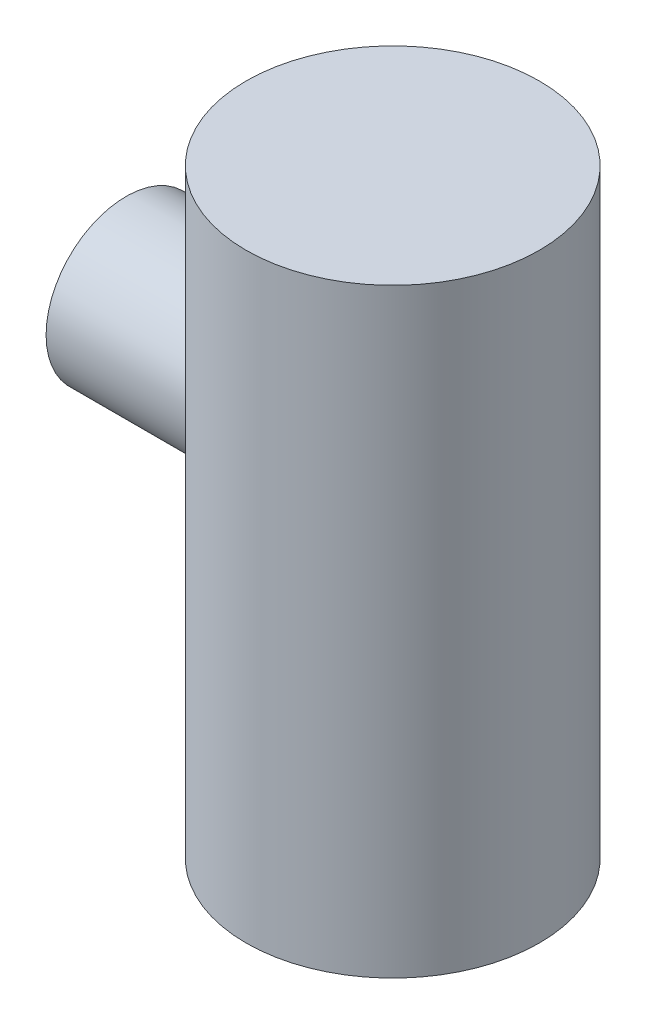
ISO-10303-21;
HEADER;
FILE_DESCRIPTION(('STEP AP214'),'2;1');
FILE_NAME('part.step','',(''),(''),'','','');
FILE_SCHEMA(('AUTOMOTIVE_DESIGN { 1 0 10303 214 1 1 1 1 }'));
ENDSEC;
DATA;
#1=APPLICATION_CONTEXT('core data for automotive mechanical design processes');
#2=APPLICATION_PROTOCOL_DEFINITION('international standard','automotive_design',2000,#1);
#3=PRODUCT_CONTEXT('',#1,'mechanical');
#4=PRODUCT('Part','Part','',(#3));
#5=PRODUCT_RELATED_PRODUCT_CATEGORY('part','',(#4));
#6=PRODUCT_DEFINITION_FORMATION('','',#4);
#7=PRODUCT_DEFINITION_CONTEXT('part definition',#1,'design');
#8=PRODUCT_DEFINITION('design','',#6,#7);
#9=PRODUCT_DEFINITION_SHAPE('','',#8);
#10=(LENGTH_UNIT() NAMED_UNIT(*) SI_UNIT(.MILLI.,.METRE.));
#11=(NAMED_UNIT(*) PLANE_ANGLE_UNIT() SI_UNIT($,.RADIAN.));
#12=(NAMED_UNIT(*) SI_UNIT($,.STERADIAN.) SOLID_ANGLE_UNIT());
#13=UNCERTAINTY_MEASURE_WITH_UNIT(LENGTH_MEASURE(1.E-05),#10,'distance_accuracy_value','');
#14=(GEOMETRIC_REPRESENTATION_CONTEXT(3) GLOBAL_UNCERTAINTY_ASSIGNED_CONTEXT((#13)) GLOBAL_UNIT_ASSIGNED_CONTEXT((#10,
#11,#12)) REPRESENTATION_CONTEXT('',''));
#15=CARTESIAN_POINT('',(0.,0.,0.));
#16=DIRECTION('',(0.,0.,1.));
#17=DIRECTION('',(1.,0.,0.));
#18=AXIS2_PLACEMENT_3D('',#15,#16,#17);
#19=CARTESIAN_POINT('',(0.,114.3,0.));
#20=DIRECTION('',(0.,-1.,0.));
#21=DIRECTION('',(0.,0.,-1.));
#22=AXIS2_PLACEMENT_3D('',#19,#20,#21);
#23=CYLINDRICAL_SURFACE('',#22,27.94);
#24=CARTESIAN_POINT('',(-27.94,28.575,0.));
#25=CARTESIAN_POINT('',(-27.9399977109418,28.5749923753979,0.177726493025734));
#26=CARTESIAN_POINT('',(-27.9382862587098,28.5600268653449,0.355567155420309));
#27=CARTESIAN_POINT('',(-27.9316235327957,28.5005577744009,0.706308578503385));
#28=CARTESIAN_POINT('',(-27.9266687863786,28.4560225311868,0.879203836592862));
#29=CARTESIAN_POINT('',(-27.9140781927207,28.3387354462199,1.21492529506599));
#30=CARTESIAN_POINT('',(-27.9064440614806,28.2660016609927,1.37775786174449));
#31=CARTESIAN_POINT('',(-27.8893459603641,28.0944195615946,1.68887152995537));
#32=CARTESIAN_POINT('',(-27.8798823284444,27.995576069335,1.83715531141358));
#33=CARTESIAN_POINT('',(-27.8601349618844,27.7740946885637,2.1156757081925));
#34=CARTESIAN_POINT('',(-27.8498480315765,27.6513611419821,2.24583603642154));
#35=CARTESIAN_POINT('',(-27.8296395480978,27.3857885013388,2.48375833310637));
#36=CARTESIAN_POINT('',(-27.8197180127136,27.2429484301635,2.59151921238911));
#37=CARTESIAN_POINT('',(-27.8013317623023,26.9407297526066,2.78186167739817));
#38=CARTESIAN_POINT('',(-27.7928711477832,26.7813065451914,2.86437287739365));
#39=CARTESIAN_POINT('',(-27.7784058118464,26.4507549024244,3.00142435019446));
#40=CARTESIAN_POINT('',(-27.7724010130427,26.2796268361067,3.05596550438725));
#41=CARTESIAN_POINT('',(-27.7635570650764,25.9313091553327,3.13529932844987));
#42=CARTESIAN_POINT('',(-27.7607043151531,25.7541490105764,3.16021984384838));
#43=CARTESIAN_POINT('',(-27.7584456007982,25.3981396840878,3.18000039489289));
#44=CARTESIAN_POINT('',(-27.7590395209577,25.2192905591098,3.17486143705606));
#45=CARTESIAN_POINT('',(-27.7635946021711,24.8658664250491,3.13477406315418));
#46=CARTESIAN_POINT('',(-27.7675399230913,24.691275277644,3.09996587375451));
#47=CARTESIAN_POINT('',(-27.7783285530449,24.3504287516643,3.00174661369565));
#48=CARTESIAN_POINT('',(-27.785171911423,24.1841735150789,2.93833505600678));
#49=CARTESIAN_POINT('',(-27.8010036468343,23.8642790166213,2.78455640720902));
#50=CARTESIAN_POINT('',(-27.8099969123514,23.7106695949077,2.69412776556504));
#51=CARTESIAN_POINT('',(-27.8291112185739,23.420753898942,2.48892600790803));
#52=CARTESIAN_POINT('',(-27.839232301925,23.2844482794079,2.37415197118544));
#53=CARTESIAN_POINT('',(-27.8595323727865,23.0321950302007,2.12273737537937));
#54=CARTESIAN_POINT('',(-27.8697113613144,22.9163679466687,1.98597583385981));
#55=CARTESIAN_POINT('',(-27.8889260991379,22.7092962087504,1.69488664217585));
#56=CARTESIAN_POINT('',(-27.8979618465154,22.6180515956063,1.54055896254118));
#57=CARTESIAN_POINT('',(-27.9138762968433,22.4627371864451,1.21862987580965));
#58=CARTESIAN_POINT('',(-27.9207544553354,22.3986742481702,1.05102513164616));
#59=CARTESIAN_POINT('',(-27.9315735545041,22.2996338460639,0.707342260946025));
#60=CARTESIAN_POINT('',(-27.9355146087106,22.2646552580083,0.531264462204478));
#61=CARTESIAN_POINT('',(-27.9400007826411,22.224931111337,0.176676764342702));
#62=CARTESIAN_POINT('',(-27.9405645699206,22.2200193575464,-0.00181428946255621));
#63=CARTESIAN_POINT('',(-27.9382829222867,22.240130718575,-0.357076979208575));
#64=CARTESIAN_POINT('',(-27.9354375471324,22.2651533086766,-0.53384864523364));
#65=CARTESIAN_POINT('',(-27.9266690458364,22.3442850763063,-0.880169427327214));
#66=CARTESIAN_POINT('',(-27.9207542335601,22.3983156963966,-1.04973672155552));
#67=CARTESIAN_POINT('',(-27.906509680628,22.5338485751161,-1.3774023069347));
#68=CARTESIAN_POINT('',(-27.898179871158,22.6153516165685,-1.53550027111238));
#69=CARTESIAN_POINT('',(-27.8799888771011,22.8039227079589,-1.83648605535923));
#70=CARTESIAN_POINT('',(-27.8701212676476,22.9110990777626,-1.97930561700081));
#71=CARTESIAN_POINT('',(-27.8499805446274,23.1478202488672,-2.24498770244583));
#72=CARTESIAN_POINT('',(-27.8397074178496,23.2773657793807,-2.36784957539485));
#73=CARTESIAN_POINT('',(-27.8198565831892,23.5558767478562,-2.59071229549484));
#74=CARTESIAN_POINT('',(-27.8102823537933,23.7049302087914,-2.69060349482674));
#75=CARTESIAN_POINT('',(-27.7929686060496,24.017795466638,-2.86393363542961));
#76=CARTESIAN_POINT('',(-27.785229056429,24.181607011926,-2.93737302759346));
#77=CARTESIAN_POINT('',(-27.7724838198148,24.5189739504899,-3.0555344360088));
#78=CARTESIAN_POINT('',(-27.7674720948894,24.6925068783265,-3.10031991547082));
#79=CARTESIAN_POINT('',(-27.7607320041799,25.0446900326591,-3.16010735382826));
#80=CARTESIAN_POINT('',(-27.759003514106,25.2233400651824,-3.17511044016476));
#81=CARTESIAN_POINT('',(-27.7590287603174,25.5795959269791,-3.17488896167793));
#82=CARTESIAN_POINT('',(-27.7607626543748,25.7572018895908,-3.15983663840781));
#83=CARTESIAN_POINT('',(-27.7674748158608,26.1073433183981,-3.10029463019608));
#84=CARTESIAN_POINT('',(-27.772453085373,26.2798787813372,-3.05580492634959));
#85=CARTESIAN_POINT('',(-27.7850872442106,26.6149690560936,-2.93870193735184));
#86=CARTESIAN_POINT('',(-27.7927424895534,26.7775262572701,-2.86609541562951));
#87=CARTESIAN_POINT('',(-27.809869235819,27.0881760497359,-2.6948370030244));
#88=CARTESIAN_POINT('',(-27.8193407437607,27.2362685851237,-2.59618501148953));
#89=CARTESIAN_POINT('',(-27.839097900828,27.5146671676606,-2.37499267977462));
#90=CARTESIAN_POINT('',(-27.8493877436328,27.6448708432514,-2.25232386030035));
#91=CARTESIAN_POINT('',(-27.8695844409381,27.8829152477503,-1.98684335479591));
#92=CARTESIAN_POINT('',(-27.8794912039081,27.9907506586777,-1.84402689225884));
#93=CARTESIAN_POINT('',(-27.8978394068627,28.1812797148728,-1.54179502521832));
#94=CARTESIAN_POINT('',(-27.9062761001334,28.2638925418281,-1.38232841577389));
#95=CARTESIAN_POINT('',(-27.9206841464976,28.4010533434178,-1.05178536089044));
#96=CARTESIAN_POINT('',(-27.9266582257361,28.4556323683905,-0.880721998908063));
#97=CARTESIAN_POINT('',(-27.9339982756156,28.5218478620223,-0.5906101971984));
#98=CARTESIAN_POINT('',(-27.9362381854083,28.5417519550023,-0.473403942302186));
#99=CARTESIAN_POINT('',(-27.9392398082135,28.5683305337763,-0.237482113836395));
#100=CARTESIAN_POINT('',(-27.9400015296737,28.5750050951755,-0.118766548896249));
#101=CARTESIAN_POINT('',(-27.94,28.575,0.));
#102=B_SPLINE_CURVE_WITH_KNOTS('',3,(#24,#25,#26,#27,#28,#29,#30,#31,#32,#33,#34,#35,#36,#37,
#38,#39,#40,#41,#42,#43,#44,#45,#46,#47,#48,#49,#50,#51,#52,#53,#54,#55,#56,#57,#58,#59,#60,#61,
#62,#63,#64,#65,#66,#67,#68,#69,#70,#71,#72,#73,#74,#75,#76,#77,#78,#79,#80,#81,#82,#83,#84,#85,
#86,#87,#88,#89,#90,#91,#92,#93,#94,#95,#96,#97,#98,#99,#100,#101),.UNSPECIFIED.,.T.,.F.,(4,2,2,
2,2,2,2,2,2,2,2,2,2,2,2,2,2,2,2,2,2,2,2,2,2,2,2,2,2,2,2,2,2,2,2,2,2,2,4),(0.,0.5327457241294,
1.06606281725818,1.59903897109533,2.13191676422734,2.66697385257084,3.20205695197831,
3.73861833398452,4.27516280691826,4.80938299437484,5.34358529400241,5.87527668730579,
6.40697713406298,6.93989826358357,7.47283955104731,8.00882047731427,8.54480230279611,
9.08091927237255,9.61701551796464,10.1501457826337,10.6832667022264,11.2149510918224,
11.746650632982,12.2806342864763,12.8146353505977,13.3511348113049,13.8876251265029,
14.4229230617994,14.9582007324924,15.4904196377583,16.0226388848193,16.5547301873412,
17.0868235461472,17.621845229172,18.1569939664043,18.69383985636,19.2300898446913,
19.5861016672066,19.9421114551503),.UNSPECIFIED.);
#103=CARTESIAN_POINT('',(-27.94,28.575,0.));
#104=VERTEX_POINT('',#103);
#105=EDGE_CURVE('E91',#104,#104,#102,.T.);
#106=ORIENTED_EDGE('',*,*,#105,.T.);
#107=EDGE_LOOP('',(#106));
#108=FACE_BOUND('',#107,.T.);
#109=CARTESIAN_POINT('',(0.,114.3,0.));
#110=DIRECTION('',(0.,1.,0.));
#111=DIRECTION('',(0.,0.,1.));
#112=AXIS2_PLACEMENT_3D('',#109,#110,#111);
#113=CIRCLE('',#112,27.94);
#114=CARTESIAN_POINT('',(0.,114.3,27.94));
#115=VERTEX_POINT('',#114);
#116=EDGE_CURVE('E53',#115,#115,#113,.T.);
#117=ORIENTED_EDGE('',*,*,#116,.F.);
#118=EDGE_LOOP('',(#117));
#119=FACE_BOUND('',#118,.T.);
#120=CARTESIAN_POINT('',(0.,0.,0.));
#121=DIRECTION('',(0.,1.,0.));
#122=DIRECTION('',(0.,0.,1.));
#123=AXIS2_PLACEMENT_3D('',#120,#121,#122);
#124=CIRCLE('',#123,27.94);
#125=CARTESIAN_POINT('',(0.,0.,27.94));
#126=VERTEX_POINT('',#125);
#127=EDGE_CURVE('E95',#126,#126,#124,.T.);
#128=ORIENTED_EDGE('',*,*,#127,.T.);
#129=EDGE_LOOP('',(#128));
#130=FACE_BOUND('',#129,.T.);
#131=CARTESIAN_POINT('',(-23.4176429215239,68.58,15.24));
#132=CARTESIAN_POINT('',(-23.4176383820855,68.9713251294594,15.2400034501273));
#133=CARTESIAN_POINT('',(-23.4274835983225,69.3626120252211,15.2249099053513));
#134=CARTESIAN_POINT('',(-23.4664545607048,70.1420491278527,15.1647752538329));
#135=CARTESIAN_POINT('',(-23.4955868779533,70.5301982200386,15.1197239404747));
#136=CARTESIAN_POINT('',(-23.572037025561,71.3006925345169,15.0002558070464));
#137=CARTESIAN_POINT('',(-23.6193816728181,71.6830283298821,14.925795679378));
#138=CARTESIAN_POINT('',(-23.7304656038211,72.4385833449601,14.7485427780727));
#139=CARTESIAN_POINT('',(-23.7942039577523,72.8118030804013,14.6457516112858));
#140=CARTESIAN_POINT('',(-23.935415497499,73.5445319497101,14.4138049542253));
#141=CARTESIAN_POINT('',(-24.0127981965139,73.9041135278635,14.2848223548774));
#142=CARTESIAN_POINT('',(-24.1792052311072,74.6104095532767,14.001308621911));
#143=CARTESIAN_POINT('',(-24.2682341206373,74.9571188987307,13.8467674879863));
#144=CARTESIAN_POINT('',(-24.4554154484938,75.6360500249483,13.5134293802223));
#145=CARTESIAN_POINT('',(-24.5535672236517,75.9682728562025,13.3346341690473));
#146=CARTESIAN_POINT('',(-24.7565130907444,76.6170316985802,12.9539637279667));
#147=CARTESIAN_POINT('',(-24.8613067270604,76.933568783067,12.7520900804351));
#148=CARTESIAN_POINT('',(-25.0857644468004,77.5805876882586,12.3051451612256));
#149=CARTESIAN_POINT('',(-25.2058714267114,77.9093295362219,12.0577747191158));
#150=CARTESIAN_POINT('',(-25.448129647856,78.5453283996593,11.5377031344762));
#151=CARTESIAN_POINT('',(-25.5702810020631,78.8525842229114,11.2650005882639));
#152=CARTESIAN_POINT('',(-25.813767994526,79.4445038292519,10.6952796638071));
#153=CARTESIAN_POINT('',(-25.9351029545473,79.7291505477039,10.3982432562462));
#154=CARTESIAN_POINT('',(-26.1739847179127,80.2740764148968,9.78138463809));
#155=CARTESIAN_POINT('',(-26.2915328513444,80.5343641820596,9.46157055751187));
#156=CARTESIAN_POINT('',(-26.529828872945,81.0500621227847,8.77243641904143));
#157=CARTESIAN_POINT('',(-26.6500088182614,81.303204555108,8.40121638677076));
#158=CARTESIAN_POINT('',(-26.8794501040104,81.7770379690629,7.63534894022219));
#159=CARTESIAN_POINT('',(-26.9887106667686,81.9977266398766,7.24069986052223));
#160=CARTESIAN_POINT('',(-27.193111046209,82.4042594138218,6.43060571123405));
#161=CARTESIAN_POINT('',(-27.2882589331282,82.590123447316,6.01517270997962));
#162=CARTESIAN_POINT('',(-27.4616257624459,82.9248738930584,5.16626395294078));
#163=CARTESIAN_POINT('',(-27.5398469128985,83.0737651286976,4.73279055929085));
#164=CARTESIAN_POINT('',(-27.6712555520536,83.3218624497381,3.8875282384062));
#165=CARTESIAN_POINT('',(-27.7259704177376,83.4241427646741,3.47687819215716));
#166=CARTESIAN_POINT('',(-27.8175074717554,83.5944227745293,2.64655744037078));
#167=CARTESIAN_POINT('',(-27.8543305561587,83.6624241862363,2.2268871876896));
#168=CARTESIAN_POINT('',(-27.9089879103373,83.7631286133492,1.38236672983906));
#169=CARTESIAN_POINT('',(-27.9268340093024,83.7958536182662,0.957519918715855));
#170=CARTESIAN_POINT('',(-27.9430403198644,83.8255786782469,0.106219923132054));
#171=CARTESIAN_POINT('',(-27.9414020393116,83.8225814977666,-0.320233134471584));
#172=CARTESIAN_POINT('',(-27.9198727636314,83.7830755597573,-1.12693068810305));
#173=CARTESIAN_POINT('',(-27.9018824488156,83.7500562953649,-1.50740308739781));
#174=CARTESIAN_POINT('',(-27.8507201449013,83.6557483058025,-2.26376437529911));
#175=CARTESIAN_POINT('',(-27.8175494360373,83.5944619645255,-2.63965364767852));
#176=CARTESIAN_POINT('',(-27.7368049378376,83.4443313489904,-3.38430768561242));
#177=CARTESIAN_POINT('',(-27.6892306454677,83.3554861122563,-3.75307220186162));
#178=CARTESIAN_POINT('',(-27.5807613470565,83.151200495487,-4.481148170951));
#179=CARTESIAN_POINT('',(-27.5198658261636,83.0357590875283,-4.84045925782445));
#180=CARTESIAN_POINT('',(-27.3853463034205,82.7780071638329,-5.55146534985035));
#181=CARTESIAN_POINT('',(-27.3115892768399,82.6354142449576,-5.9030325833718));
#182=CARTESIAN_POINT('',(-27.153393651098,82.325491591733,-6.59256802882112));
#183=CARTESIAN_POINT('',(-27.0689550990471,82.1581619664831,-6.93053630071787));
#184=CARTESIAN_POINT('',(-26.8910998735849,81.8000382086617,-7.59140803855563));
#185=CARTESIAN_POINT('',(-26.7976814259893,81.6092394371315,-7.91430850871009));
#186=CARTESIAN_POINT('',(-26.6037075125378,81.2054743707124,-8.54370046693588));
#187=CARTESIAN_POINT('',(-26.503151384262,80.9925060174941,-8.85019042736977));
#188=CARTESIAN_POINT('',(-26.2858074576784,80.521767235917,-9.47742129087769));
#189=CARTESIAN_POINT('',(-26.1684326062453,80.2616410530619,-9.79619296875736));
#190=CARTESIAN_POINT('',(-25.9299950910655,79.7172583185583,-10.4109402141405));
#191=CARTESIAN_POINT('',(-25.8089322000587,79.4330002779478,-10.7069143728601));
#192=CARTESIAN_POINT('',(-25.5658205009505,78.8414785256524,-11.2751052111942));
#193=CARTESIAN_POINT('',(-25.443770865999,78.5341932303348,-11.5472990705538));
#194=CARTESIAN_POINT('',(-25.2017418036908,77.8981691981364,-12.0663928565235));
#195=CARTESIAN_POINT('',(-25.0817624665109,77.5694295297275,-12.3132916836498));
#196=CARTESIAN_POINT('',(-24.8368818851103,76.862738633263,-12.8005261779932));
#197=CARTESIAN_POINT('',(-24.7124398825421,76.4829843368539,-13.0384864675512));
#198=CARTESIAN_POINT('',(-24.4737452395732,75.7015558179261,-13.4811966591811));
#199=CARTESIAN_POINT('',(-24.3594916445186,75.2998836548094,-13.6859496742506));
#200=CARTESIAN_POINT('',(-24.1454702805095,74.4770625512019,-14.0600963255986));
#201=CARTESIAN_POINT('',(-24.0456904901869,74.0559301614361,-14.229519357339));
#202=CARTESIAN_POINT('',(-23.8646850843039,73.1966457099472,-14.5310493489796));
#203=CARTESIAN_POINT('',(-23.7834565113205,72.7584963741036,-14.6631622576307));
#204=CARTESIAN_POINT('',(-23.6490280735429,71.9046934412061,-14.878908060381));
#205=CARTESIAN_POINT('',(-23.5940926225163,71.4900865332568,-14.9655977680894));
#206=CARTESIAN_POINT('',(-23.5055215040194,70.6528494330091,-15.1043332122817));
#207=CARTESIAN_POINT('',(-23.4718844852174,70.2302197514881,-15.1563811467093));
#208=CARTESIAN_POINT('',(-23.4275167063492,69.3812761809011,-15.2248724127573));
#209=CARTESIAN_POINT('',(-23.4167645669467,68.9549661043563,-15.2413489757975));
#210=CARTESIAN_POINT('',(-23.4186334240675,68.1025410185296,-15.2384787012164));
#211=CARTESIAN_POINT('',(-23.4312519849907,67.6764259935494,-15.2191355965763));
#212=CARTESIAN_POINT('',(-23.4758137806337,66.8888926865455,-15.1502840824961));
#213=CARTESIAN_POINT('',(-23.5047576365329,66.5268817024677,-15.1054504796351));
#214=CARTESIAN_POINT('',(-23.5783597563596,65.80860345804,-14.9903043135166));
#215=CARTESIAN_POINT('',(-23.6230162000653,65.4523355373835,-14.9199947014947));
#216=CARTESIAN_POINT('',(-23.7266054116749,64.7475878233147,-14.7547038345987));
#217=CARTESIAN_POINT('',(-23.7855430376177,64.399110724265,-14.6597141835041));
#218=CARTESIAN_POINT('',(-23.9159070712627,63.7118925086996,-14.4460594278099));
#219=CARTESIAN_POINT('',(-23.9873343340283,63.3731520606226,-14.3273927021563));
#220=CARTESIAN_POINT('',(-24.143969148131,62.6927699291245,-14.0619022010764));
#221=CARTESIAN_POINT('',(-24.2296336377348,62.3516177729942,-13.9140954094515));
#222=CARTESIAN_POINT('',(-24.4100971808085,61.6828569372728,-13.5950119170237));
#223=CARTESIAN_POINT('',(-24.5048994929921,61.3552531492387,-13.4237268341754));
#224=CARTESIAN_POINT('',(-24.7013099178542,60.7147818236723,-13.0587835358266));
#225=CARTESIAN_POINT('',(-24.8029198076153,60.4019181705634,-12.865119468772));
#226=CARTESIAN_POINT('',(-25.0106367366716,59.7920447085212,-12.4564915465405));
#227=CARTESIAN_POINT('',(-25.1167435902926,59.4950342461706,-12.2415285702809));
#228=CARTESIAN_POINT('',(-25.3479541232678,58.8728541861732,-11.7561834273768));
#229=CARTESIAN_POINT('',(-25.473445849701,58.5504888640538,-11.4823816549071));
#230=CARTESIAN_POINT('',(-25.7242515307578,57.9295639150099,-10.9089153807977));
#231=CARTESIAN_POINT('',(-25.8495654766124,57.6310054248155,-10.6092496456248));
#232=CARTESIAN_POINT('',(-26.096999130511,57.0589795658298,-9.98513855990823));
#233=CARTESIAN_POINT('',(-26.219116250295,56.7855321043932,-9.66067391649725));
#234=CARTESIAN_POINT('',(-26.4570055645999,56.2657597289012,-8.988738689992));
#235=CARTESIAN_POINT('',(-26.5727803804159,56.0194235665254,-8.64127774447786));
#236=CARTESIAN_POINT('',(-26.8005612470152,55.5442936014874,-7.90747233143188));
#237=CARTESIAN_POINT('',(-26.9121134146851,55.3169266398156,-7.52005975662921));
#238=CARTESIAN_POINT('',(-27.1220154056053,54.8960312707729,-6.72379234277238));
#239=CARTESIAN_POINT('',(-27.2203645431046,54.7025046208729,-6.31493639150526));
#240=CARTESIAN_POINT('',(-27.4008759733388,54.3516967681827,-5.47889609071193));
#241=CARTESIAN_POINT('',(-27.4830516603362,54.1943855546068,-5.05172726736768));
#242=CARTESIAN_POINT('',(-27.6287471847649,53.9179575358507,-4.18212502135385));
#243=CARTESIAN_POINT('',(-27.6922697417498,53.798835162654,-3.73969383439867));
#244=CARTESIAN_POINT('',(-27.7932132934953,53.6106202093673,-2.88885331135169));
#245=CARTESIAN_POINT('',(-27.8326238237017,53.5376872998123,-2.48152631781014));
#246=CARTESIAN_POINT('',(-27.8936184837097,53.4251260480805,-1.66097513710634));
#247=CARTESIAN_POINT('',(-27.9152038332944,53.3854954270135,-1.24775135543222));
#248=CARTESIAN_POINT('',(-27.9399310441044,53.3401146143988,-0.419074333500842));
#249=CARTESIAN_POINT('',(-27.9430807464282,53.3343500188593,-0.00362211631456578));
#250=CARTESIAN_POINT('',(-27.930866299464,53.3567484832766,0.826082763265364));
#251=CARTESIAN_POINT('',(-27.9155030305057,53.3849099299806,1.24033548175871));
#252=CARTESIAN_POINT('',(-27.8688384595369,53.4708202115822,2.02813888705947));
#253=CARTESIAN_POINT('',(-27.8390440405368,53.525774396909,2.40208842770487));
#254=CARTESIAN_POINT('',(-27.7651025425636,53.6629540712638,3.14347581478081));
#255=CARTESIAN_POINT('',(-27.7209565207832,53.7451775515427,3.51091413875017));
#256=CARTESIAN_POINT('',(-27.6193039280973,53.9360092677702,4.23698709178416));
#257=CARTESIAN_POINT('',(-27.5617965588141,54.0446190803935,4.59562119335553));
#258=CARTESIAN_POINT('',(-27.4346687474209,54.2871448275513,5.30201508115151));
#259=CARTESIAN_POINT('',(-27.365047726277,54.4210619718054,5.64977434661983));
#260=CARTESIAN_POINT('',(-27.2125017895185,54.7181434171783,6.34462601285483));
#261=CARTESIAN_POINT('',(-27.1291953086509,54.8821701843087,6.69126545315428));
#262=CARTESIAN_POINT('',(-26.9529212799796,55.2346914122792,7.36928451099998));
#263=CARTESIAN_POINT('',(-26.8599536154698,55.423186168697,7.70066394413709));
#264=CARTESIAN_POINT('',(-26.6662247023624,55.8233469624595,8.34684785215691));
#265=CARTESIAN_POINT('',(-26.5654613008363,56.0350194074776,8.66164770766771));
#266=CARTESIAN_POINT('',(-26.3581472304902,56.4802176604843,9.27340345002949));
#267=CARTESIAN_POINT('',(-26.2515959516654,56.7137457738013,9.57035744906846));
#268=CARTESIAN_POINT('',(-26.0224363798374,57.2292114062077,10.1780896364997));
#269=CARTESIAN_POINT('',(-25.8993807053818,57.5136336118068,10.4865951961075));
#270=CARTESIAN_POINT('',(-25.6516327670691,58.10656624899,11.0788264312882));
#271=CARTESIAN_POINT('',(-25.5269403800578,58.4150785019724,11.3625502297216));
#272=CARTESIAN_POINT('',(-25.2788786314908,59.0551463460567,11.9042319863776));
#273=CARTESIAN_POINT('',(-25.1555110191214,59.386728897179,12.1621589107053));
#274=CARTESIAN_POINT('',(-24.9135150792201,60.0711984999879,12.6504795133731));
#275=CARTESIAN_POINT('',(-24.7948865220683,60.4240845173786,12.8808745267884));
#276=CARTESIAN_POINT('',(-24.558521256809,61.1726469760418,13.3262958657315));
#277=CARTESIAN_POINT('',(-24.441313306449,61.5696184221093,13.539434665317));
#278=CARTESIAN_POINT('',(-24.2202858672578,62.3840484716102,13.9309706080502));
#279=CARTESIAN_POINT('',(-24.1164686856399,62.8015105885009,14.1093617669151));
#280=CARTESIAN_POINT('',(-23.9267339429651,63.6531019508093,14.4287720398582));
#281=CARTESIAN_POINT('',(-23.8407672467366,64.0871814416934,14.5698940403701));
#282=CARTESIAN_POINT('',(-23.6903547355099,64.9695132476717,14.8132106836247));
#283=CARTESIAN_POINT('',(-23.6258950470461,65.4177562212579,14.9154304269475));
#284=CARTESIAN_POINT('',(-23.5226899560311,66.3159059650677,15.0776576791922));
#285=CARTESIAN_POINT('',(-23.4834817213553,66.7656212863401,15.1384262511102));
#286=CARTESIAN_POINT('',(-23.4309608614763,67.6702416285862,15.2195953764924));
#287=CARTESIAN_POINT('',(-23.4176481979007,68.1251466418687,15.2399959897746));
#288=CARTESIAN_POINT('',(-23.4176429215239,68.58,15.24));
#289=B_SPLINE_CURVE_WITH_KNOTS('',3,(#131,#132,#133,#134,#135,#136,#137,#138,#139,#140,#141,
#142,#143,#144,#145,#146,#147,#148,#149,#150,#151,#152,#153,#154,#155,#156,#157,#158,#159,#160,
#161,#162,#163,#164,#165,#166,#167,#168,#169,#170,#171,#172,#173,#174,#175,#176,#177,#178,#179,
#180,#181,#182,#183,#184,#185,#186,#187,#188,#189,#190,#191,#192,#193,#194,#195,#196,#197,#198,
#199,#200,#201,#202,#203,#204,#205,#206,#207,#208,#209,#210,#211,#212,#213,#214,#215,#216,#217,
#218,#219,#220,#221,#222,#223,#224,#225,#226,#227,#228,#229,#230,#231,#232,#233,#234,#235,#236,
#237,#238,#239,#240,#241,#242,#243,#244,#245,#246,#247,#248,#249,#250,#251,#252,#253,#254,#255,
#256,#257,#258,#259,#260,#261,#262,#263,#264,#265,#266,#267,#268,#269,#270,#271,#272,#273,#274,
#275,#276,#277,#278,#279,#280,#281,#282,#283,#284,#285,#286,#287,#288),.UNSPECIFIED.,.T.,.F.,(4,
2,2,2,2,2,2,2,2,2,2,2,2,2,2,2,2,2,2,2,2,2,2,2,2,2,2,2,2,2,2,2,2,2,2,2,2,2,2,2,2,2,2,2,2,2,2,2,2,
2,2,2,2,2,2,2,2,2,2,2,2,2,2,2,2,2,2,2,2,2,2,2,2,2,2,2,2,2,4),(0.,1.173499821812,2.3473996601571,
3.52303467478884,4.69860302470887,5.86664990617678,7.03515489615287,8.20357501051918,
9.37191506010035,10.6563542146608,11.9408645840446,13.2263354261285,14.5113497235447,
15.9048705200063,17.2984904918865,18.6913104335466,20.0839485753653,21.3623246783529,
22.6406367501602,23.9181515258772,25.1955674383729,26.3411848058238,27.4867055757389,
28.6322663567121,29.7778714202488,30.9361163504288,32.0943561724056,33.2528253034072,
34.4114020882853,35.6936091234763,36.9758953298192,38.2593988398097,39.5429581154154,
40.9365071000756,42.3299253716472,43.7221796161081,45.1142117531389,46.3936575400095,
47.6730221411444,48.9511910185526,50.2292266978597,51.3257347568205,52.4221158328027,
53.5188703902992,54.6157000630221,55.7591864852735,56.9030822150411,58.0472777251178,
59.1914260386721,60.5135113981443,61.8356598468827,63.1588475707661,64.4814842255817,
65.8681599339265,67.254907636851,68.6405020081724,70.0258942648259,71.2712291222291,
72.5164787538779,73.7611987141326,75.0058594877361,76.1419680126542,77.2779928665285,
78.4140856185211,79.5502326908069,80.7263088076142,81.9023991329543,83.0788154235368,
84.2553559422637,85.5657897610231,86.8763227550587,88.1884138342778,89.5004412618479,
90.8952699781975,92.2903387017389,93.6815149134271,95.0717919800713,96.4358013050179,
97.7998086087529),.UNSPECIFIED.);
#290=CARTESIAN_POINT('',(-23.4176429215239,68.58,15.24));
#291=VERTEX_POINT('',#290);
#292=EDGE_CURVE('E11',#291,#291,#289,.T.);
#293=ORIENTED_EDGE('',*,*,#292,.F.);
#294=EDGE_LOOP('',(#293));
#295=FACE_BOUND('',#294,.T.);
#296=ADVANCED_FACE('F41',(#108,#119,#130,#295),#23,.T.);
#297=CARTESIAN_POINT('',(0.,114.3,0.));
#298=DIRECTION('',(0.,1.,0.));
#299=DIRECTION('',(0.,0.,1.));
#300=AXIS2_PLACEMENT_3D('',#297,#298,#299);
#301=PLANE('',#300);
#302=ORIENTED_EDGE('',*,*,#116,.T.);
#303=EDGE_LOOP('',(#302));
#304=FACE_BOUND('',#303,.T.);
#305=ADVANCED_FACE('F113',(#304),#301,.T.);
#306=CARTESIAN_POINT('',(0.,0.,0.));
#307=DIRECTION('',(0.,1.,0.));
#308=DIRECTION('',(0.,0.,1.));
#309=AXIS2_PLACEMENT_3D('',#306,#307,#308);
#310=PLANE('',#309);
#311=CARTESIAN_POINT('',(0.,0.,0.));
#312=DIRECTION('',(0.,-1.,0.));
#313=DIRECTION('',(0.,0.,-1.));
#314=AXIS2_PLACEMENT_3D('',#311,#312,#313);
#315=CIRCLE('',#314,3.175);
#316=CARTESIAN_POINT('',(0.,0.,-3.175));
#317=VERTEX_POINT('',#316);
#318=EDGE_CURVE('E73',#317,#317,#315,.T.);
#319=ORIENTED_EDGE('',*,*,#318,.F.);
#320=EDGE_LOOP('',(#319));
#321=FACE_BOUND('',#320,.T.);
#322=ORIENTED_EDGE('',*,*,#127,.F.);
#323=EDGE_LOOP('',(#322));
#324=FACE_BOUND('',#323,.T.);
#325=ADVANCED_FACE('F110',(#321,#324),#310,.F.);
#326=CARTESIAN_POINT('',(-14.9935436266372,25.4,0.));
#327=DIRECTION('',(1.,0.,0.));
#328=DIRECTION('',(0.,1.,0.));
#329=AXIS2_PLACEMENT_3D('',#326,#327,#328);
#330=CYLINDRICAL_SURFACE('',#329,3.175);
#331=CARTESIAN_POINT('',(-14.9935436266372,25.4,0.));
#332=DIRECTION('',(1.,0.,0.));
#333=DIRECTION('',(0.,1.,0.));
#334=AXIS2_PLACEMENT_3D('',#331,#332,#333);
#335=CIRCLE('',#334,3.175);
#336=CARTESIAN_POINT('',(-14.9935436266372,28.575,0.));
#337=VERTEX_POINT('',#336);
#338=EDGE_CURVE('E84',#337,#337,#335,.T.);
#339=ORIENTED_EDGE('',*,*,#338,.T.);
#340=EDGE_LOOP('',(#339));
#341=FACE_BOUND('',#340,.T.);
#342=ORIENTED_EDGE('',*,*,#105,.F.);
#343=EDGE_LOOP('',(#342));
#344=FACE_BOUND('',#343,.T.);
#345=ADVANCED_FACE('F104',(#341,#344),#330,.F.);
#346=CARTESIAN_POINT('',(-14.9935436266372,28.575,0.));
#347=DIRECTION('',(1.,0.,0.));
#348=DIRECTION('',(0.,1.,0.));
#349=AXIS2_PLACEMENT_3D('',#346,#347,#348);
#350=PLANE('',#349);
#351=ORIENTED_EDGE('',*,*,#338,.F.);
#352=EDGE_LOOP('',(#351));
#353=FACE_BOUND('',#352,.T.);
#354=ADVANCED_FACE('F109',(#353),#350,.F.);
#355=CARTESIAN_POINT('',(0.,25.4,0.));
#356=DIRECTION('',(0.,-1.,0.));
#357=DIRECTION('',(0.,0.,-1.));
#358=AXIS2_PLACEMENT_3D('',#355,#356,#357);
#359=CYLINDRICAL_SURFACE('',#358,3.175);
#360=CARTESIAN_POINT('',(0.,25.4,0.));
#361=DIRECTION('',(0.,-1.,0.));
#362=DIRECTION('',(0.,0.,-1.));
#363=AXIS2_PLACEMENT_3D('',#360,#361,#362);
#364=CIRCLE('',#363,3.175);
#365=CARTESIAN_POINT('',(0.,25.4,-3.175));
#366=VERTEX_POINT('',#365);
#367=EDGE_CURVE('E80',#366,#366,#364,.T.);
#368=ORIENTED_EDGE('',*,*,#367,.F.);
#369=EDGE_LOOP('',(#368));
#370=FACE_BOUND('',#369,.T.);
#371=ORIENTED_EDGE('',*,*,#318,.T.);
#372=EDGE_LOOP('',(#371));
#373=FACE_BOUND('',#372,.T.);
#374=ADVANCED_FACE('F144',(#370,#373),#359,.F.);
#375=CARTESIAN_POINT('',(0.,25.4,0.));
#376=DIRECTION('',(0.,-1.,0.));
#377=DIRECTION('',(0.,0.,-1.));
#378=AXIS2_PLACEMENT_3D('',#375,#376,#377);
#379=PLANE('',#378);
#380=ORIENTED_EDGE('',*,*,#367,.T.);
#381=EDGE_LOOP('',(#380));
#382=FACE_BOUND('',#381,.T.);
#383=ADVANCED_FACE('F136',(#382),#379,.T.);
#384=CARTESIAN_POINT('',(-50.8,68.58,0.));
#385=DIRECTION('',(-1.,0.,0.));
#386=DIRECTION('',(0.,0.,1.));
#387=AXIS2_PLACEMENT_3D('',#384,#385,#386);
#388=CYLINDRICAL_SURFACE('',#387,15.24);
#389=CARTESIAN_POINT('',(-50.8,68.58,0.));
#390=DIRECTION('',(-1.,0.,0.));
#391=DIRECTION('',(0.,0.,1.));
#392=AXIS2_PLACEMENT_3D('',#389,#390,#391);
#393=CIRCLE('',#392,15.24);
#394=CARTESIAN_POINT('',(-50.8,68.58,15.24));
#395=VERTEX_POINT('',#394);
#396=EDGE_CURVE('E67',#395,#395,#393,.T.);
#397=ORIENTED_EDGE('',*,*,#396,.F.);
#398=EDGE_LOOP('',(#397));
#399=FACE_BOUND('',#398,.T.);
#400=ORIENTED_EDGE('',*,*,#292,.T.);
#401=EDGE_LOOP('',(#400));
#402=FACE_BOUND('',#401,.T.);
#403=ADVANCED_FACE('F134',(#399,#402),#388,.T.);
#404=CARTESIAN_POINT('',(-50.8,83.82,0.));
#405=DIRECTION('',(1.,0.,0.));
#406=DIRECTION('',(0.,0.,-1.));
#407=AXIS2_PLACEMENT_3D('',#404,#405,#406);
#408=PLANE('',#407);
#409=CARTESIAN_POINT('',(-50.8,68.58,0.));
#410=DIRECTION('',(-1.,0.,0.));
#411=DIRECTION('',(0.,0.,1.));
#412=AXIS2_PLACEMENT_3D('',#409,#410,#411);
#413=CIRCLE('',#412,11.2997361);
#414=CARTESIAN_POINT('',(-50.8,68.58,11.2997361));
#415=VERTEX_POINT('',#414);
#416=EDGE_CURVE('E250',#415,#415,#413,.T.);
#417=ORIENTED_EDGE('',*,*,#416,.F.);
#418=EDGE_LOOP('',(#417));
#419=FACE_BOUND('',#418,.T.);
#420=ORIENTED_EDGE('',*,*,#396,.T.);
#421=EDGE_LOOP('',(#420));
#422=FACE_BOUND('',#421,.T.);
#423=ADVANCED_FACE('F60',(#419,#422),#408,.F.);
#424=CARTESIAN_POINT('',(-28.194,68.58,0.));
#425=DIRECTION('',(-1.,0.,0.));
#426=DIRECTION('',(0.,0.,1.));
#427=AXIS2_PLACEMENT_3D('',#424,#425,#426);
#428=CONICAL_SURFACE('',#427,8.92809999999999,1.02974425867665);
#429=CARTESIAN_POINT('',(-22.82945630726,68.58,0.));
#430=VERTEX_POINT('',#429);
#431=VERTEX_LOOP('',#430);
#432=FACE_BOUND('',#431,.T.);
#433=CARTESIAN_POINT('',(-28.194,68.58,0.));
#434=DIRECTION('',(-1.,0.,0.));
#435=DIRECTION('',(0.,0.,1.));
#436=AXIS2_PLACEMENT_3D('',#433,#434,#435);
#437=CIRCLE('',#436,8.92809999999999);
#438=CARTESIAN_POINT('',(-28.194,68.58,8.92809999999999));
#439=VERTEX_POINT('',#438);
#440=EDGE_CURVE('E64',#439,#439,#437,.T.);
#441=ORIENTED_EDGE('',*,*,#440,.T.);
#442=EDGE_LOOP('',(#441));
#443=FACE_BOUND('',#442,.T.);
#444=ADVANCED_FACE('F56',(#432,#443),#428,.F.);
#445=CARTESIAN_POINT('',(-50.8,68.58,0.));
#446=DIRECTION('',(-1.,0.,0.));
#447=DIRECTION('',(0.,0.,1.));
#448=AXIS2_PLACEMENT_3D('',#445,#446,#447);
#449=CYLINDRICAL_SURFACE('',#448,8.92809999999999);
#450=ORIENTED_EDGE('',*,*,#440,.F.);
#451=EDGE_LOOP('',(#450));
#452=FACE_BOUND('',#451,.T.);
#453=CARTESIAN_POINT('',(-37.338,68.58,0.));
#454=DIRECTION('',(-1.,0.,0.));
#455=DIRECTION('',(0.,0.,1.));
#456=AXIS2_PLACEMENT_3D('',#453,#454,#455);
#457=CIRCLE('',#456,8.92809999999999);
#458=CARTESIAN_POINT('',(-37.338,68.58,8.92809999999999));
#459=VERTEX_POINT('',#458);
#460=EDGE_CURVE('E68',#459,#459,#457,.T.);
#461=ORIENTED_EDGE('',*,*,#460,.T.);
#462=EDGE_LOOP('',(#461));
#463=FACE_BOUND('',#462,.T.);
#464=ADVANCED_FACE('F59',(#452,#463),#449,.F.);
#465=CARTESIAN_POINT('',(-37.338,77.5081,0.));
#466=DIRECTION('',(1.,0.,0.));
#467=DIRECTION('',(0.,0.,-1.));
#468=AXIS2_PLACEMENT_3D('',#465,#466,#467);
#469=PLANE('',#468);
#470=ORIENTED_EDGE('',*,*,#460,.F.);
#471=EDGE_LOOP('',(#470));
#472=FACE_BOUND('',#471,.T.);
#473=CARTESIAN_POINT('',(-37.338,68.58,0.));
#474=DIRECTION('',(-1.,0.,0.));
#475=DIRECTION('',(0.,0.,1.));
#476=AXIS2_PLACEMENT_3D('',#473,#474,#475);
#477=CIRCLE('',#476,10.2806785424596);
#478=CARTESIAN_POINT('',(-37.338,68.58,10.2806785424596));
#479=VERTEX_POINT('',#478);
#480=EDGE_CURVE('E76',#479,#479,#477,.T.);
#481=ORIENTED_EDGE('',*,*,#480,.T.);
#482=EDGE_LOOP('',(#481));
#483=FACE_BOUND('',#482,.T.);
#484=ADVANCED_FACE('F215',(#472,#483),#469,.F.);
#485=CARTESIAN_POINT('',(-50.165,68.58,0.));
#486=DIRECTION('',(-1.,0.,0.));
#487=DIRECTION('',(0.,0.,1.));
#488=AXIS2_PLACEMENT_3D('',#485,#486,#487);
#489=CONICAL_SURFACE('',#488,10.6647361,0.0299323966717032);
#490=ORIENTED_EDGE('',*,*,#480,.F.);
#491=EDGE_LOOP('',(#490));
#492=FACE_BOUND('',#491,.T.);
#493=CARTESIAN_POINT('',(-50.165,68.58,0.));
#494=DIRECTION('',(-1.,0.,0.));
#495=DIRECTION('',(0.,0.,1.));
#496=AXIS2_PLACEMENT_3D('',#493,#494,#495);
#497=CIRCLE('',#496,10.6647361);
#498=CARTESIAN_POINT('',(-50.165,68.58,10.6647361));
#499=VERTEX_POINT('',#498);
#500=EDGE_CURVE('E247',#499,#499,#497,.T.);
#501=ORIENTED_EDGE('',*,*,#500,.T.);
#502=EDGE_LOOP('',(#501));
#503=FACE_BOUND('',#502,.T.);
#504=ADVANCED_FACE('F172',(#492,#503),#489,.F.);
#505=CARTESIAN_POINT('',(-50.8,68.58,0.));
#506=DIRECTION('',(-1.,0.,0.));
#507=DIRECTION('',(0.,0.,1.));
#508=AXIS2_PLACEMENT_3D('',#505,#506,#507);
#509=CONICAL_SURFACE('',#508,11.2997361,0.785398163397448);
#510=ORIENTED_EDGE('',*,*,#500,.F.);
#511=EDGE_LOOP('',(#510));
#512=FACE_BOUND('',#511,.T.);
#513=ORIENTED_EDGE('',*,*,#416,.T.);
#514=EDGE_LOOP('',(#513));
#515=FACE_BOUND('',#514,.T.);
#516=ADVANCED_FACE('F230',(#512,#515),#509,.F.);
#517=CLOSED_SHELL('',(#296,#305,#325,#345,#354,#374,#383,#403,#423,#444,#464,#484,#504,#516));
#518=MANIFOLD_SOLID_BREP('B2',#517);
#519=ADVANCED_BREP_SHAPE_REPRESENTATION('',(#18,#518),#14);
#520=SHAPE_DEFINITION_REPRESENTATION(#9,#519);
ENDSEC;
END-ISO-10303-21;
